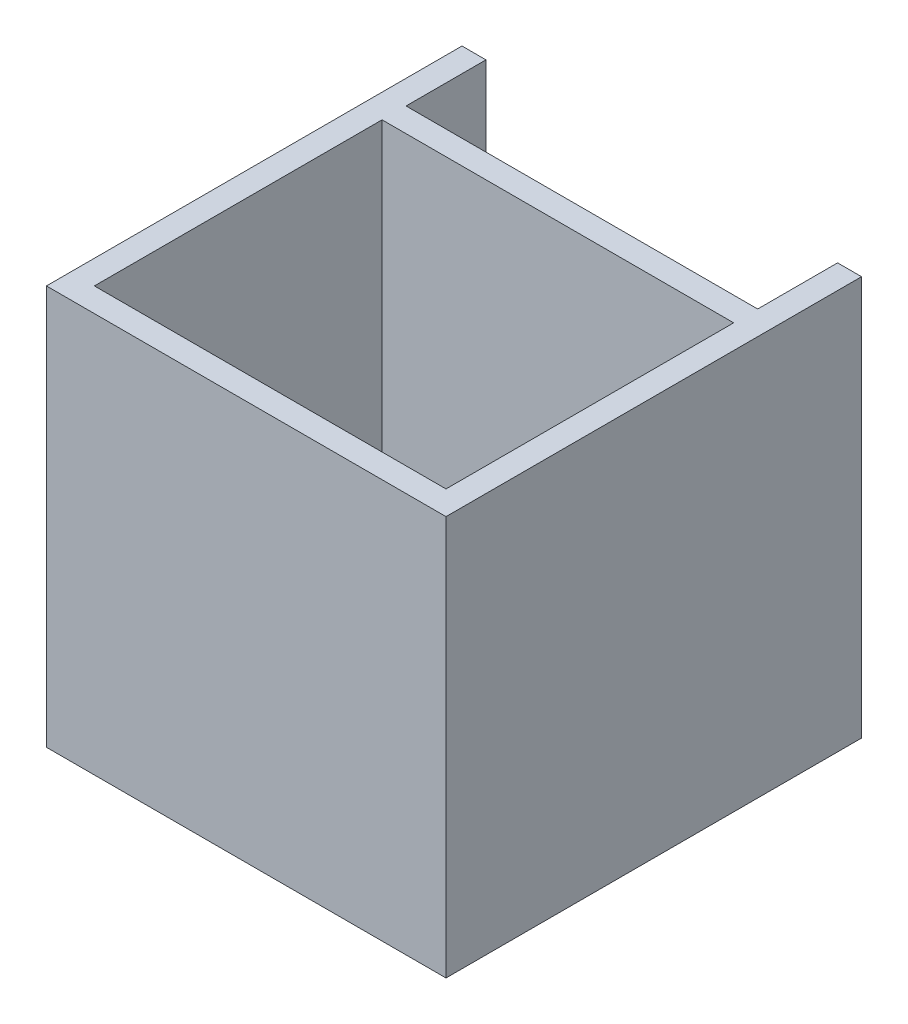
ISO-10303-21;
HEADER;
FILE_DESCRIPTION(('STEP AP214'),'2;1');
FILE_NAME('part.step','',(''),(''),'','','');
FILE_SCHEMA(('AUTOMOTIVE_DESIGN { 1 0 10303 214 1 1 1 1 }'));
ENDSEC;
DATA;
#1=APPLICATION_CONTEXT('core data for automotive mechanical design processes');
#2=APPLICATION_PROTOCOL_DEFINITION('international standard','automotive_design',2000,#1);
#3=PRODUCT_CONTEXT('',#1,'mechanical');
#4=PRODUCT('Part','Part','',(#3));
#5=PRODUCT_RELATED_PRODUCT_CATEGORY('part','',(#4));
#6=PRODUCT_DEFINITION_FORMATION('','',#4);
#7=PRODUCT_DEFINITION_CONTEXT('part definition',#1,'design');
#8=PRODUCT_DEFINITION('design','',#6,#7);
#9=PRODUCT_DEFINITION_SHAPE('','',#8);
#10=(LENGTH_UNIT() NAMED_UNIT(*) SI_UNIT(.MILLI.,.METRE.));
#11=(NAMED_UNIT(*) PLANE_ANGLE_UNIT() SI_UNIT($,.RADIAN.));
#12=(NAMED_UNIT(*) SI_UNIT($,.STERADIAN.) SOLID_ANGLE_UNIT());
#13=UNCERTAINTY_MEASURE_WITH_UNIT(LENGTH_MEASURE(1.E-05),#10,'distance_accuracy_value','');
#14=(GEOMETRIC_REPRESENTATION_CONTEXT(3) GLOBAL_UNCERTAINTY_ASSIGNED_CONTEXT((#13)) GLOBAL_UNIT_ASSIGNED_CONTEXT((#10,
#11,#12)) REPRESENTATION_CONTEXT('',''));
#15=CARTESIAN_POINT('',(0.,0.,0.));
#16=DIRECTION('',(0.,0.,1.));
#17=DIRECTION('',(1.,0.,0.));
#18=AXIS2_PLACEMENT_3D('',#15,#16,#17);
#19=CARTESIAN_POINT('',(0.,25.,13.));
#20=DIRECTION('',(0.,0.,1.));
#21=DIRECTION('',(1.,0.,0.));
#22=AXIS2_PLACEMENT_3D('',#19,#20,#21);
#23=PLANE('',#22);
#24=DIRECTION('',(-1.,0.,0.));
#25=VECTOR('',#24,1.);
#26=CARTESIAN_POINT('',(0.,0.,13.));
#27=LINE('',#26,#25);
#28=CARTESIAN_POINT('',(12.5,0.,13.));
#29=VERTEX_POINT('',#28);
#30=CARTESIAN_POINT('',(-12.5,0.,13.));
#31=VERTEX_POINT('',#30);
#32=EDGE_CURVE('E200',#29,#31,#27,.T.);
#33=ORIENTED_EDGE('',*,*,#32,.F.);
#34=DIRECTION('',(0.,-1.,0.));
#35=VECTOR('',#34,1.);
#36=CARTESIAN_POINT('',(12.5,25.,13.));
#37=LINE('',#36,#35);
#38=CARTESIAN_POINT('',(12.5,25.,13.));
#39=VERTEX_POINT('',#38);
#40=EDGE_CURVE('E11',#39,#29,#37,.T.);
#41=ORIENTED_EDGE('',*,*,#40,.F.);
#42=DIRECTION('',(-1.,0.,0.));
#43=VECTOR('',#42,1.);
#44=CARTESIAN_POINT('',(0.,25.,13.));
#45=LINE('',#44,#43);
#46=CARTESIAN_POINT('',(-12.5,25.,13.));
#47=VERTEX_POINT('',#46);
#48=EDGE_CURVE('E222',#39,#47,#45,.T.);
#49=ORIENTED_EDGE('',*,*,#48,.T.);
#50=DIRECTION('',(0.,-1.,0.));
#51=VECTOR('',#50,1.);
#52=CARTESIAN_POINT('',(-12.5,25.,13.));
#53=LINE('',#52,#51);
#54=EDGE_CURVE('E56',#47,#31,#53,.T.);
#55=ORIENTED_EDGE('',*,*,#54,.T.);
#56=EDGE_LOOP('',(#33,#41,#49,#55));
#57=FACE_BOUND('',#56,.T.);
#58=ADVANCED_FACE('F37',(#57),#23,.T.);
#59=CARTESIAN_POINT('',(12.5,25.,0.));
#60=DIRECTION('',(-1.,0.,0.));
#61=DIRECTION('',(0.,0.,1.));
#62=AXIS2_PLACEMENT_3D('',#59,#60,#61);
#63=PLANE('',#62);
#64=DIRECTION('',(0.,0.,-1.));
#65=VECTOR('',#64,1.);
#66=CARTESIAN_POINT('',(12.5,0.,0.));
#67=LINE('',#66,#65);
#68=CARTESIAN_POINT('',(12.5,0.,-13.));
#69=VERTEX_POINT('',#68);
#70=EDGE_CURVE('E197',#29,#69,#67,.T.);
#71=ORIENTED_EDGE('',*,*,#70,.T.);
#72=DIRECTION('',(0.,-1.,0.));
#73=VECTOR('',#72,1.);
#74=CARTESIAN_POINT('',(12.5,25.,-13.));
#75=LINE('',#74,#73);
#76=CARTESIAN_POINT('',(12.5,25.,-13.));
#77=VERTEX_POINT('',#76);
#78=EDGE_CURVE('E47',#77,#69,#75,.T.);
#79=ORIENTED_EDGE('',*,*,#78,.F.);
#80=DIRECTION('',(0.,0.,-1.));
#81=VECTOR('',#80,1.);
#82=CARTESIAN_POINT('',(12.5,25.,0.));
#83=LINE('',#82,#81);
#84=EDGE_CURVE('E219',#39,#77,#83,.T.);
#85=ORIENTED_EDGE('',*,*,#84,.F.);
#86=ORIENTED_EDGE('',*,*,#40,.T.);
#87=EDGE_LOOP('',(#71,#79,#85,#86));
#88=FACE_BOUND('',#87,.T.);
#89=ADVANCED_FACE('F252',(#88),#63,.F.);
#90=CARTESIAN_POINT('',(0.,25.,-13.));
#91=DIRECTION('',(0.,0.,1.));
#92=DIRECTION('',(1.,0.,0.));
#93=AXIS2_PLACEMENT_3D('',#90,#91,#92);
#94=PLANE('',#93);
#95=DIRECTION('',(-1.,0.,0.));
#96=VECTOR('',#95,1.);
#97=CARTESIAN_POINT('',(0.,0.,-13.));
#98=LINE('',#97,#96);
#99=CARTESIAN_POINT('',(11.,0.,-13.));
#100=VERTEX_POINT('',#99);
#101=EDGE_CURVE('E194',#69,#100,#98,.T.);
#102=ORIENTED_EDGE('',*,*,#101,.T.);
#103=DIRECTION('',(0.,-1.,0.));
#104=VECTOR('',#103,1.);
#105=CARTESIAN_POINT('',(11.,25.,-13.));
#106=LINE('',#105,#104);
#107=CARTESIAN_POINT('',(11.,25.,-13.));
#108=VERTEX_POINT('',#107);
#109=EDGE_CURVE('E164',#108,#100,#106,.T.);
#110=ORIENTED_EDGE('',*,*,#109,.F.);
#111=DIRECTION('',(-1.,0.,0.));
#112=VECTOR('',#111,1.);
#113=CARTESIAN_POINT('',(0.,25.,-13.));
#114=LINE('',#113,#112);
#115=EDGE_CURVE('E217',#77,#108,#114,.T.);
#116=ORIENTED_EDGE('',*,*,#115,.F.);
#117=ORIENTED_EDGE('',*,*,#78,.T.);
#118=EDGE_LOOP('',(#102,#110,#116,#117));
#119=FACE_BOUND('',#118,.T.);
#120=ADVANCED_FACE('F257',(#119),#94,.F.);
#121=CARTESIAN_POINT('',(11.,25.,0.));
#122=DIRECTION('',(-1.,0.,0.));
#123=DIRECTION('',(0.,0.,1.));
#124=AXIS2_PLACEMENT_3D('',#121,#122,#123);
#125=PLANE('',#124);
#126=DIRECTION('',(0.,0.,-1.));
#127=VECTOR('',#126,1.);
#128=CARTESIAN_POINT('',(11.,0.,0.));
#129=LINE('',#128,#127);
#130=CARTESIAN_POINT('',(11.,0.,-8.));
#131=VERTEX_POINT('',#130);
#132=EDGE_CURVE('E191',#131,#100,#129,.T.);
#133=ORIENTED_EDGE('',*,*,#132,.F.);
#134=DIRECTION('',(0.,-1.,0.));
#135=VECTOR('',#134,1.);
#136=CARTESIAN_POINT('',(11.,25.,-8.));
#137=LINE('',#136,#135);
#138=CARTESIAN_POINT('',(11.,25.,-8.));
#139=VERTEX_POINT('',#138);
#140=EDGE_CURVE('E158',#139,#131,#137,.T.);
#141=ORIENTED_EDGE('',*,*,#140,.F.);
#142=DIRECTION('',(0.,0.,-1.));
#143=VECTOR('',#142,1.);
#144=CARTESIAN_POINT('',(11.,25.,0.));
#145=LINE('',#144,#143);
#146=EDGE_CURVE('E214',#139,#108,#145,.T.);
#147=ORIENTED_EDGE('',*,*,#146,.T.);
#148=ORIENTED_EDGE('',*,*,#109,.T.);
#149=EDGE_LOOP('',(#133,#141,#147,#148));
#150=FACE_BOUND('',#149,.T.);
#151=ADVANCED_FACE('F263',(#150),#125,.T.);
#152=CARTESIAN_POINT('',(0.,25.,-8.));
#153=DIRECTION('',(0.,0.,-1.));
#154=DIRECTION('',(-1.,0.,0.));
#155=AXIS2_PLACEMENT_3D('',#152,#153,#154);
#156=PLANE('',#155);
#157=DIRECTION('',(1.,0.,0.));
#158=VECTOR('',#157,1.);
#159=CARTESIAN_POINT('',(0.,0.,-8.));
#160=LINE('',#159,#158);
#161=CARTESIAN_POINT('',(-11.,0.,-8.));
#162=VERTEX_POINT('',#161);
#163=EDGE_CURVE('E188',#162,#131,#160,.T.);
#164=ORIENTED_EDGE('',*,*,#163,.F.);
#165=DIRECTION('',(0.,-1.,0.));
#166=VECTOR('',#165,1.);
#167=CARTESIAN_POINT('',(-11.,25.,-8.));
#168=LINE('',#167,#166);
#169=CARTESIAN_POINT('',(-11.,25.,-8.));
#170=VERTEX_POINT('',#169);
#171=EDGE_CURVE('E156',#170,#162,#168,.T.);
#172=ORIENTED_EDGE('',*,*,#171,.F.);
#173=DIRECTION('',(1.,0.,0.));
#174=VECTOR('',#173,1.);
#175=CARTESIAN_POINT('',(0.,25.,-8.));
#176=LINE('',#175,#174);
#177=EDGE_CURVE('E150',#170,#139,#176,.T.);
#178=ORIENTED_EDGE('',*,*,#177,.T.);
#179=ORIENTED_EDGE('',*,*,#140,.T.);
#180=EDGE_LOOP('',(#164,#172,#178,#179));
#181=FACE_BOUND('',#180,.T.);
#182=ADVANCED_FACE('F267',(#181),#156,.T.);
#183=CARTESIAN_POINT('',(-11.,25.,0.));
#184=DIRECTION('',(-1.,0.,0.));
#185=DIRECTION('',(0.,0.,1.));
#186=AXIS2_PLACEMENT_3D('',#183,#184,#185);
#187=PLANE('',#186);
#188=DIRECTION('',(0.,0.,-1.));
#189=VECTOR('',#188,1.);
#190=CARTESIAN_POINT('',(-11.,0.,0.));
#191=LINE('',#190,#189);
#192=CARTESIAN_POINT('',(-11.,0.,-13.));
#193=VERTEX_POINT('',#192);
#194=EDGE_CURVE('E155',#162,#193,#191,.T.);
#195=ORIENTED_EDGE('',*,*,#194,.T.);
#196=DIRECTION('',(0.,-1.,0.));
#197=VECTOR('',#196,1.);
#198=CARTESIAN_POINT('',(-11.,25.,-13.));
#199=LINE('',#198,#197);
#200=CARTESIAN_POINT('',(-11.,25.,-13.));
#201=VERTEX_POINT('',#200);
#202=EDGE_CURVE('E137',#201,#193,#199,.T.);
#203=ORIENTED_EDGE('',*,*,#202,.F.);
#204=DIRECTION('',(0.,0.,-1.));
#205=VECTOR('',#204,1.);
#206=CARTESIAN_POINT('',(-11.,25.,0.));
#207=LINE('',#206,#205);
#208=EDGE_CURVE('E142',#170,#201,#207,.T.);
#209=ORIENTED_EDGE('',*,*,#208,.F.);
#210=ORIENTED_EDGE('',*,*,#171,.T.);
#211=EDGE_LOOP('',(#195,#203,#209,#210));
#212=FACE_BOUND('',#211,.T.);
#213=ADVANCED_FACE('F153',(#212),#187,.F.);
#214=CARTESIAN_POINT('',(0.,25.,-13.0000000000001));
#215=DIRECTION('',(0.,0.,1.));
#216=DIRECTION('',(1.,0.,0.));
#217=AXIS2_PLACEMENT_3D('',#214,#215,#216);
#218=PLANE('',#217);
#219=DIRECTION('',(-1.,0.,0.));
#220=VECTOR('',#219,1.);
#221=CARTESIAN_POINT('',(0.,0.,-13.0000000000001));
#222=LINE('',#221,#220);
#223=CARTESIAN_POINT('',(-12.5,0.,-13.));
#224=VERTEX_POINT('',#223);
#225=EDGE_CURVE('E185',#193,#224,#222,.T.);
#226=ORIENTED_EDGE('',*,*,#225,.T.);
#227=DIRECTION('',(0.,-1.,0.));
#228=VECTOR('',#227,1.);
#229=CARTESIAN_POINT('',(-12.5,25.,-13.));
#230=LINE('',#229,#228);
#231=CARTESIAN_POINT('',(-12.5,25.,-13.));
#232=VERTEX_POINT('',#231);
#233=EDGE_CURVE('E94',#232,#224,#230,.T.);
#234=ORIENTED_EDGE('',*,*,#233,.F.);
#235=DIRECTION('',(-1.,0.,0.));
#236=VECTOR('',#235,1.);
#237=CARTESIAN_POINT('',(0.,25.,-13.0000000000001));
#238=LINE('',#237,#236);
#239=EDGE_CURVE('E133',#201,#232,#238,.T.);
#240=ORIENTED_EDGE('',*,*,#239,.F.);
#241=ORIENTED_EDGE('',*,*,#202,.T.);
#242=EDGE_LOOP('',(#226,#234,#240,#241));
#243=FACE_BOUND('',#242,.T.);
#244=ADVANCED_FACE('F135',(#243),#218,.F.);
#245=CARTESIAN_POINT('',(0.,25.,11.5));
#246=DIRECTION('',(0.,0.,-1.));
#247=DIRECTION('',(-1.,0.,0.));
#248=AXIS2_PLACEMENT_3D('',#245,#246,#247);
#249=PLANE('',#248);
#250=DIRECTION('',(1.,0.,0.));
#251=VECTOR('',#250,1.);
#252=CARTESIAN_POINT('',(0.,0.,11.5));
#253=LINE('',#252,#251);
#254=CARTESIAN_POINT('',(-11.,0.,11.5));
#255=VERTEX_POINT('',#254);
#256=CARTESIAN_POINT('',(11.,0.,11.5));
#257=VERTEX_POINT('',#256);
#258=EDGE_CURVE('E209',#255,#257,#253,.T.);
#259=ORIENTED_EDGE('',*,*,#258,.F.);
#260=DIRECTION('',(0.,-1.,0.));
#261=VECTOR('',#260,1.);
#262=CARTESIAN_POINT('',(-11.,25.,11.5));
#263=LINE('',#262,#261);
#264=CARTESIAN_POINT('',(-11.,25.,11.5));
#265=VERTEX_POINT('',#264);
#266=EDGE_CURVE('E41',#265,#255,#263,.T.);
#267=ORIENTED_EDGE('',*,*,#266,.F.);
#268=DIRECTION('',(1.,0.,0.));
#269=VECTOR('',#268,1.);
#270=CARTESIAN_POINT('',(0.,25.,11.5));
#271=LINE('',#270,#269);
#272=CARTESIAN_POINT('',(11.,25.,11.5));
#273=VERTEX_POINT('',#272);
#274=EDGE_CURVE('E184',#265,#273,#271,.T.);
#275=ORIENTED_EDGE('',*,*,#274,.T.);
#276=DIRECTION('',(0.,-1.,0.));
#277=VECTOR('',#276,1.);
#278=CARTESIAN_POINT('',(11.,25.,11.5));
#279=LINE('',#278,#277);
#280=EDGE_CURVE('E168',#273,#257,#279,.T.);
#281=ORIENTED_EDGE('',*,*,#280,.T.);
#282=EDGE_LOOP('',(#259,#267,#275,#281));
#283=FACE_BOUND('',#282,.T.);
#284=ADVANCED_FACE('F39',(#283),#249,.T.);
#285=CARTESIAN_POINT('',(-11.,25.,0.));
#286=DIRECTION('',(-1.,0.,0.));
#287=DIRECTION('',(0.,0.,1.));
#288=AXIS2_PLACEMENT_3D('',#285,#286,#287);
#289=PLANE('',#288);
#290=DIRECTION('',(0.,0.,-1.));
#291=VECTOR('',#290,1.);
#292=CARTESIAN_POINT('',(-11.,0.,0.));
#293=LINE('',#292,#291);
#294=CARTESIAN_POINT('',(-11.,0.,-6.5));
#295=VERTEX_POINT('',#294);
#296=EDGE_CURVE('E207',#255,#295,#293,.T.);
#297=ORIENTED_EDGE('',*,*,#296,.T.);
#298=DIRECTION('',(0.,-1.,0.));
#299=VECTOR('',#298,1.);
#300=CARTESIAN_POINT('',(-11.,25.,-6.5));
#301=LINE('',#300,#299);
#302=CARTESIAN_POINT('',(-11.,25.,-6.5));
#303=VERTEX_POINT('',#302);
#304=EDGE_CURVE('E171',#303,#295,#301,.T.);
#305=ORIENTED_EDGE('',*,*,#304,.F.);
#306=DIRECTION('',(0.,0.,-1.));
#307=VECTOR('',#306,1.);
#308=CARTESIAN_POINT('',(-11.,25.,0.));
#309=LINE('',#308,#307);
#310=EDGE_CURVE('E229',#265,#303,#309,.T.);
#311=ORIENTED_EDGE('',*,*,#310,.F.);
#312=ORIENTED_EDGE('',*,*,#266,.T.);
#313=EDGE_LOOP('',(#297,#305,#311,#312));
#314=FACE_BOUND('',#313,.T.);
#315=ADVANCED_FACE('F241',(#314),#289,.F.);
#316=CARTESIAN_POINT('',(0.,25.,-6.5));
#317=DIRECTION('',(0.,0.,-1.));
#318=DIRECTION('',(-1.,0.,0.));
#319=AXIS2_PLACEMENT_3D('',#316,#317,#318);
#320=PLANE('',#319);
#321=DIRECTION('',(1.,0.,0.));
#322=VECTOR('',#321,1.);
#323=CARTESIAN_POINT('',(0.,0.,-6.5));
#324=LINE('',#323,#322);
#325=CARTESIAN_POINT('',(11.,0.,-6.5));
#326=VERTEX_POINT('',#325);
#327=EDGE_CURVE('E205',#295,#326,#324,.T.);
#328=ORIENTED_EDGE('',*,*,#327,.T.);
#329=DIRECTION('',(0.,-1.,0.));
#330=VECTOR('',#329,1.);
#331=CARTESIAN_POINT('',(11.,25.,-6.5));
#332=LINE('',#331,#330);
#333=CARTESIAN_POINT('',(11.,25.,-6.5));
#334=VERTEX_POINT('',#333);
#335=EDGE_CURVE('E170',#334,#326,#332,.T.);
#336=ORIENTED_EDGE('',*,*,#335,.F.);
#337=DIRECTION('',(1.,0.,0.));
#338=VECTOR('',#337,1.);
#339=CARTESIAN_POINT('',(0.,25.,-6.5));
#340=LINE('',#339,#338);
#341=EDGE_CURVE('E227',#303,#334,#340,.T.);
#342=ORIENTED_EDGE('',*,*,#341,.F.);
#343=ORIENTED_EDGE('',*,*,#304,.T.);
#344=EDGE_LOOP('',(#328,#336,#342,#343));
#345=FACE_BOUND('',#344,.T.);
#346=ADVANCED_FACE('F242',(#345),#320,.F.);
#347=CARTESIAN_POINT('',(11.,25.,0.));
#348=DIRECTION('',(-1.,0.,0.));
#349=DIRECTION('',(0.,0.,1.));
#350=AXIS2_PLACEMENT_3D('',#347,#348,#349);
#351=PLANE('',#350);
#352=DIRECTION('',(0.,0.,-1.));
#353=VECTOR('',#352,1.);
#354=CARTESIAN_POINT('',(11.,0.,0.));
#355=LINE('',#354,#353);
#356=EDGE_CURVE('E202',#257,#326,#355,.T.);
#357=ORIENTED_EDGE('',*,*,#356,.F.);
#358=ORIENTED_EDGE('',*,*,#280,.F.);
#359=DIRECTION('',(0.,0.,-1.));
#360=VECTOR('',#359,1.);
#361=CARTESIAN_POINT('',(11.,25.,0.));
#362=LINE('',#361,#360);
#363=EDGE_CURVE('E224',#273,#334,#362,.T.);
#364=ORIENTED_EDGE('',*,*,#363,.T.);
#365=ORIENTED_EDGE('',*,*,#335,.T.);
#366=EDGE_LOOP('',(#357,#358,#364,#365));
#367=FACE_BOUND('',#366,.T.);
#368=ADVANCED_FACE('F237',(#367),#351,.T.);
#369=CARTESIAN_POINT('',(-12.5,25.,0.));
#370=DIRECTION('',(-1.,0.,0.));
#371=DIRECTION('',(0.,0.,1.));
#372=AXIS2_PLACEMENT_3D('',#369,#370,#371);
#373=PLANE('',#372);
#374=DIRECTION('',(0.,0.,-1.));
#375=VECTOR('',#374,1.);
#376=CARTESIAN_POINT('',(-12.5,0.,0.));
#377=LINE('',#376,#375);
#378=EDGE_CURVE('E181',#31,#224,#377,.T.);
#379=ORIENTED_EDGE('',*,*,#378,.F.);
#380=ORIENTED_EDGE('',*,*,#54,.F.);
#381=DIRECTION('',(0.,0.,-1.));
#382=VECTOR('',#381,1.);
#383=CARTESIAN_POINT('',(-12.5,25.,0.));
#384=LINE('',#383,#382);
#385=EDGE_CURVE('E141',#47,#232,#384,.T.);
#386=ORIENTED_EDGE('',*,*,#385,.T.);
#387=ORIENTED_EDGE('',*,*,#233,.T.);
#388=EDGE_LOOP('',(#379,#380,#386,#387));
#389=FACE_BOUND('',#388,.T.);
#390=ADVANCED_FACE('F249',(#389),#373,.T.);
#391=CARTESIAN_POINT('',(0.,25.,0.));
#392=DIRECTION('',(0.,1.,0.));
#393=DIRECTION('',(0.,0.,1.));
#394=AXIS2_PLACEMENT_3D('',#391,#392,#393);
#395=PLANE('',#394);
#396=ORIENTED_EDGE('',*,*,#274,.F.);
#397=ORIENTED_EDGE('',*,*,#310,.T.);
#398=ORIENTED_EDGE('',*,*,#341,.T.);
#399=ORIENTED_EDGE('',*,*,#363,.F.);
#400=EDGE_LOOP('',(#396,#397,#398,#399));
#401=FACE_BOUND('',#400,.T.);
#402=ORIENTED_EDGE('',*,*,#48,.F.);
#403=ORIENTED_EDGE('',*,*,#84,.T.);
#404=ORIENTED_EDGE('',*,*,#115,.T.);
#405=ORIENTED_EDGE('',*,*,#146,.F.);
#406=ORIENTED_EDGE('',*,*,#177,.F.);
#407=ORIENTED_EDGE('',*,*,#208,.T.);
#408=ORIENTED_EDGE('',*,*,#239,.T.);
#409=ORIENTED_EDGE('',*,*,#385,.F.);
#410=EDGE_LOOP('',(#402,#403,#404,#405,#406,#407,#408,#409));
#411=FACE_BOUND('',#410,.T.);
#412=ADVANCED_FACE('F147',(#401,#411),#395,.T.);
#413=CARTESIAN_POINT('',(0.,0.,0.));
#414=DIRECTION('',(0.,1.,0.));
#415=DIRECTION('',(0.,0.,1.));
#416=AXIS2_PLACEMENT_3D('',#413,#414,#415);
#417=PLANE('',#416);
#418=ORIENTED_EDGE('',*,*,#258,.T.);
#419=ORIENTED_EDGE('',*,*,#356,.T.);
#420=ORIENTED_EDGE('',*,*,#327,.F.);
#421=ORIENTED_EDGE('',*,*,#296,.F.);
#422=EDGE_LOOP('',(#418,#419,#420,#421));
#423=FACE_BOUND('',#422,.T.);
#424=ORIENTED_EDGE('',*,*,#32,.T.);
#425=ORIENTED_EDGE('',*,*,#378,.T.);
#426=ORIENTED_EDGE('',*,*,#225,.F.);
#427=ORIENTED_EDGE('',*,*,#194,.F.);
#428=ORIENTED_EDGE('',*,*,#163,.T.);
#429=ORIENTED_EDGE('',*,*,#132,.T.);
#430=ORIENTED_EDGE('',*,*,#101,.F.);
#431=ORIENTED_EDGE('',*,*,#70,.F.);
#432=EDGE_LOOP('',(#424,#425,#426,#427,#428,#429,#430,#431));
#433=FACE_BOUND('',#432,.T.);
#434=ADVANCED_FACE('F239',(#423,#433),#417,.F.);
#435=CLOSED_SHELL('',(#58,#89,#120,#151,#182,#213,#244,#284,#315,#346,#368,#390,#412,#434));
#436=MANIFOLD_SOLID_BREP('B2',#435);
#437=ADVANCED_BREP_SHAPE_REPRESENTATION('',(#18,#436),#14);
#438=SHAPE_DEFINITION_REPRESENTATION(#9,#437);
ENDSEC;
END-ISO-10303-21;
